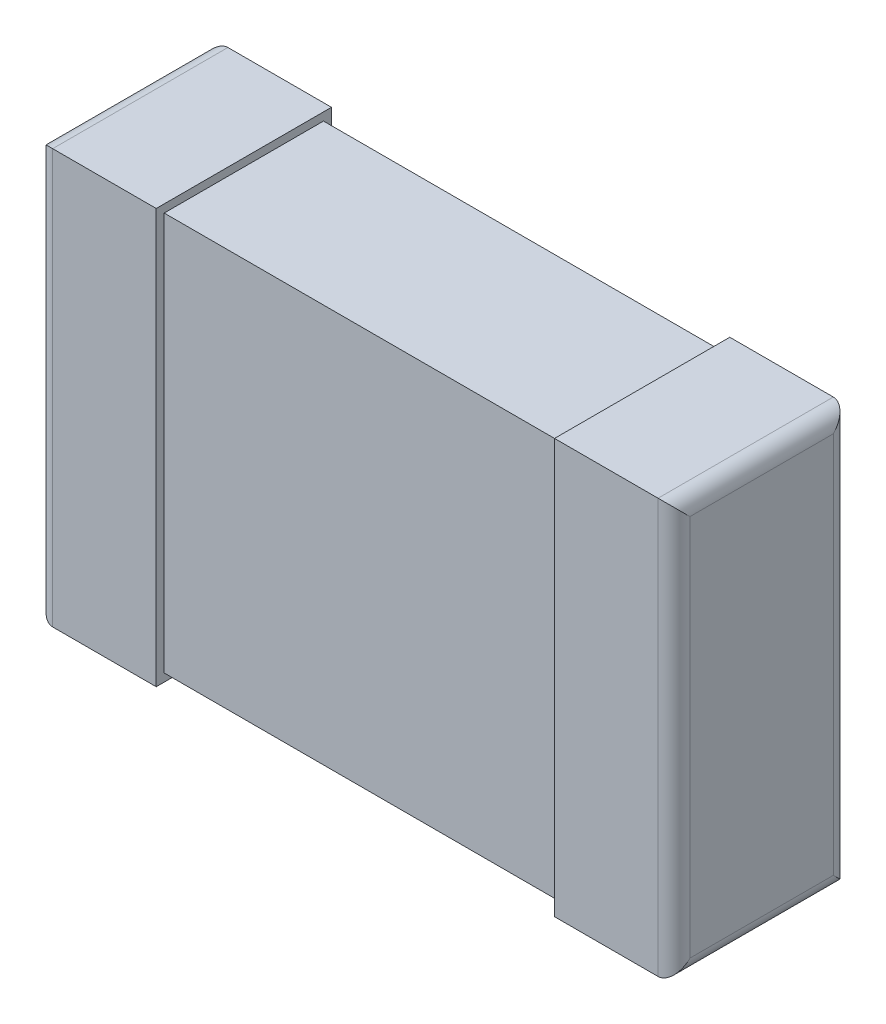
ISO-10303-21;
HEADER;
FILE_DESCRIPTION(('STEP AP214'),'2;1');
FILE_NAME('part.step','',(''),(''),'','','');
FILE_SCHEMA(('AUTOMOTIVE_DESIGN { 1 0 10303 214 1 1 1 1 }'));
ENDSEC;
DATA;
#1=APPLICATION_CONTEXT('core data for automotive mechanical design processes');
#2=APPLICATION_PROTOCOL_DEFINITION('international standard','automotive_design',2000,#1);
#3=PRODUCT_CONTEXT('',#1,'mechanical');
#4=PRODUCT('Part','Part','',(#3));
#5=PRODUCT_RELATED_PRODUCT_CATEGORY('part','',(#4));
#6=PRODUCT_DEFINITION_FORMATION('','',#4);
#7=PRODUCT_DEFINITION_CONTEXT('part definition',#1,'design');
#8=PRODUCT_DEFINITION('design','',#6,#7);
#9=PRODUCT_DEFINITION_SHAPE('','',#8);
#10=(LENGTH_UNIT() NAMED_UNIT(*) SI_UNIT(.MILLI.,.METRE.));
#11=(NAMED_UNIT(*) PLANE_ANGLE_UNIT() SI_UNIT($,.RADIAN.));
#12=(NAMED_UNIT(*) SI_UNIT($,.STERADIAN.) SOLID_ANGLE_UNIT());
#13=UNCERTAINTY_MEASURE_WITH_UNIT(LENGTH_MEASURE(1.E-05),#10,'distance_accuracy_value','');
#14=(GEOMETRIC_REPRESENTATION_CONTEXT(3) GLOBAL_UNCERTAINTY_ASSIGNED_CONTEXT((#13)) GLOBAL_UNIT_ASSIGNED_CONTEXT((#10,
#11,#12)) REPRESENTATION_CONTEXT('',''));
#15=CARTESIAN_POINT('',(0.,0.,0.));
#16=DIRECTION('',(0.,0.,1.));
#17=DIRECTION('',(1.,0.,0.));
#18=AXIS2_PLACEMENT_3D('',#15,#16,#17);
#19=CARTESIAN_POINT('',(0.,0.,0.508));
#20=DIRECTION('',(0.,1.,0.));
#21=DIRECTION('',(0.,0.,1.));
#22=AXIS2_PLACEMENT_3D('',#19,#20,#21);
#23=PLANE('',#22);
#24=DIRECTION('',(0.,0.,-1.));
#25=VECTOR('',#24,1.);
#26=CARTESIAN_POINT('',(1.651,0.,0.508));
#27=LINE('',#26,#25);
#28=CARTESIAN_POINT('',(1.651,0.,0.508));
#29=VERTEX_POINT('',#28);
#30=CARTESIAN_POINT('',(1.651,0.,0.));
#31=VERTEX_POINT('',#30);
#32=EDGE_CURVE('E190',#29,#31,#27,.T.);
#33=ORIENTED_EDGE('',*,*,#32,.F.);
#34=DIRECTION('',(1.,0.,0.));
#35=VECTOR('',#34,1.);
#36=CARTESIAN_POINT('',(0.,0.,0.508));
#37=LINE('',#36,#35);
#38=CARTESIAN_POINT('',(0.381,0.,0.508));
#39=VERTEX_POINT('',#38);
#40=EDGE_CURVE('E224',#39,#29,#37,.T.);
#41=ORIENTED_EDGE('',*,*,#40,.F.);
#42=DIRECTION('',(0.,0.,1.));
#43=VECTOR('',#42,1.);
#44=CARTESIAN_POINT('',(0.381,0.,0.508));
#45=LINE('',#44,#43);
#46=CARTESIAN_POINT('',(0.381,0.,0.));
#47=VERTEX_POINT('',#46);
#48=EDGE_CURVE('E218',#47,#39,#45,.T.);
#49=ORIENTED_EDGE('',*,*,#48,.F.);
#50=DIRECTION('',(1.,0.,0.));
#51=VECTOR('',#50,1.);
#52=CARTESIAN_POINT('',(0.,0.,0.));
#53=LINE('',#52,#51);
#54=EDGE_CURVE('E223',#47,#31,#53,.T.);
#55=ORIENTED_EDGE('',*,*,#54,.T.);
#56=EDGE_LOOP('',(#33,#41,#49,#55));
#57=FACE_BOUND('',#56,.T.);
#58=ADVANCED_FACE('F35',(#57),#23,.F.);
#59=CARTESIAN_POINT('',(0.,1.27,0.508));
#60=DIRECTION('',(0.,-1.,0.));
#61=DIRECTION('',(0.,0.,-1.));
#62=AXIS2_PLACEMENT_3D('',#59,#60,#61);
#63=PLANE('',#62);
#64=DIRECTION('',(0.,0.,1.));
#65=VECTOR('',#64,1.);
#66=CARTESIAN_POINT('',(1.651,1.27,0.508));
#67=LINE('',#66,#65);
#68=CARTESIAN_POINT('',(1.651,1.27,0.));
#69=VERTEX_POINT('',#68);
#70=CARTESIAN_POINT('',(1.651,1.27,0.508));
#71=VERTEX_POINT('',#70);
#72=EDGE_CURVE('E184',#69,#71,#67,.T.);
#73=ORIENTED_EDGE('',*,*,#72,.F.);
#74=DIRECTION('',(-1.,0.,0.));
#75=VECTOR('',#74,1.);
#76=CARTESIAN_POINT('',(0.,1.27,0.));
#77=LINE('',#76,#75);
#78=CARTESIAN_POINT('',(0.381,1.27,0.));
#79=VERTEX_POINT('',#78);
#80=EDGE_CURVE('E228',#69,#79,#77,.T.);
#81=ORIENTED_EDGE('',*,*,#80,.T.);
#82=DIRECTION('',(0.,0.,-1.));
#83=VECTOR('',#82,1.);
#84=CARTESIAN_POINT('',(0.381,1.27,0.508));
#85=LINE('',#84,#83);
#86=CARTESIAN_POINT('',(0.381,1.27,0.508));
#87=VERTEX_POINT('',#86);
#88=EDGE_CURVE('E210',#87,#79,#85,.T.);
#89=ORIENTED_EDGE('',*,*,#88,.F.);
#90=DIRECTION('',(-1.,0.,0.));
#91=VECTOR('',#90,1.);
#92=CARTESIAN_POINT('',(0.,1.27,0.508));
#93=LINE('',#92,#91);
#94=EDGE_CURVE('E227',#71,#87,#93,.T.);
#95=ORIENTED_EDGE('',*,*,#94,.F.);
#96=EDGE_LOOP('',(#73,#81,#89,#95));
#97=FACE_BOUND('',#96,.T.);
#98=ADVANCED_FACE('F320',(#97),#63,.F.);
#99=CARTESIAN_POINT('',(0.,0.,0.508));
#100=DIRECTION('',(0.,0.,-1.));
#101=DIRECTION('',(-1.,0.,0.));
#102=AXIS2_PLACEMENT_3D('',#99,#100,#101);
#103=PLANE('',#102);
#104=DIRECTION('',(0.,-1.,0.));
#105=VECTOR('',#104,1.);
#106=CARTESIAN_POINT('',(1.651,0.,0.508));
#107=LINE('',#106,#105);
#108=EDGE_CURVE('E192',#71,#29,#107,.T.);
#109=ORIENTED_EDGE('',*,*,#108,.F.);
#110=ORIENTED_EDGE('',*,*,#94,.T.);
#111=DIRECTION('',(0.,1.,0.));
#112=VECTOR('',#111,1.);
#113=CARTESIAN_POINT('',(0.381,0.,0.508));
#114=LINE('',#113,#112);
#115=EDGE_CURVE('E220',#39,#87,#114,.T.);
#116=ORIENTED_EDGE('',*,*,#115,.F.);
#117=ORIENTED_EDGE('',*,*,#40,.T.);
#118=EDGE_LOOP('',(#109,#110,#116,#117));
#119=FACE_BOUND('',#118,.T.);
#120=ADVANCED_FACE('F325',(#119),#103,.F.);
#121=CARTESIAN_POINT('',(0.,0.,0.));
#122=DIRECTION('',(0.,0.,-1.));
#123=DIRECTION('',(-1.,0.,0.));
#124=AXIS2_PLACEMENT_3D('',#121,#122,#123);
#125=PLANE('',#124);
#126=ORIENTED_EDGE('',*,*,#80,.F.);
#127=DIRECTION('',(0.,-1.,0.));
#128=VECTOR('',#127,1.);
#129=CARTESIAN_POINT('',(1.651,0.,0.));
#130=LINE('',#129,#128);
#131=EDGE_CURVE('E236',#69,#31,#130,.T.);
#132=ORIENTED_EDGE('',*,*,#131,.T.);
#133=ORIENTED_EDGE('',*,*,#54,.F.);
#134=DIRECTION('',(0.,1.,0.));
#135=VECTOR('',#134,1.);
#136=CARTESIAN_POINT('',(0.381,0.,0.));
#137=LINE('',#136,#135);
#138=EDGE_CURVE('E230',#47,#79,#137,.T.);
#139=ORIENTED_EDGE('',*,*,#138,.T.);
#140=EDGE_LOOP('',(#126,#132,#133,#139));
#141=FACE_BOUND('',#140,.T.);
#142=ADVANCED_FACE('F335',(#141),#125,.T.);
#143=CARTESIAN_POINT('',(0.381,0.,0.));
#144=DIRECTION('',(-1.,0.,0.));
#145=DIRECTION('',(0.,0.,1.));
#146=AXIS2_PLACEMENT_3D('',#143,#144,#145);
#147=PLANE('',#146);
#148=DIRECTION('',(0.,0.,-1.));
#149=VECTOR('',#148,1.);
#150=CARTESIAN_POINT('',(0.381,1.2954,0.5334));
#151=LINE('',#150,#149);
#152=CARTESIAN_POINT('',(0.381,1.2954,0.5334));
#153=VERTEX_POINT('',#152);
#154=CARTESIAN_POINT('',(0.381,1.2954,-0.0254));
#155=VERTEX_POINT('',#154);
#156=EDGE_CURVE('E194',#153,#155,#151,.T.);
#157=ORIENTED_EDGE('',*,*,#156,.F.);
#158=DIRECTION('',(0.,1.,0.));
#159=VECTOR('',#158,1.);
#160=CARTESIAN_POINT('',(0.381,-0.0254,0.5334));
#161=LINE('',#160,#159);
#162=CARTESIAN_POINT('',(0.381,-0.0254,0.5334));
#163=VERTEX_POINT('',#162);
#164=EDGE_CURVE('E203',#163,#153,#161,.T.);
#165=ORIENTED_EDGE('',*,*,#164,.F.);
#166=DIRECTION('',(0.,0.,1.));
#167=VECTOR('',#166,1.);
#168=CARTESIAN_POINT('',(0.381,-0.0254,-0.0254));
#169=LINE('',#168,#167);
#170=CARTESIAN_POINT('',(0.381,-0.0254,-0.0254));
#171=VERTEX_POINT('',#170);
#172=EDGE_CURVE('E200',#171,#163,#169,.T.);
#173=ORIENTED_EDGE('',*,*,#172,.F.);
#174=DIRECTION('',(0.,-1.,0.));
#175=VECTOR('',#174,1.);
#176=CARTESIAN_POINT('',(0.381,1.2954,-0.0254));
#177=LINE('',#176,#175);
#178=EDGE_CURVE('E197',#155,#171,#177,.T.);
#179=ORIENTED_EDGE('',*,*,#178,.F.);
#180=EDGE_LOOP('',(#157,#165,#173,#179));
#181=FACE_BOUND('',#180,.T.);
#182=ORIENTED_EDGE('',*,*,#48,.T.);
#183=ORIENTED_EDGE('',*,*,#115,.T.);
#184=ORIENTED_EDGE('',*,*,#88,.T.);
#185=ORIENTED_EDGE('',*,*,#138,.F.);
#186=EDGE_LOOP('',(#182,#183,#184,#185));
#187=FACE_BOUND('',#186,.T.);
#188=ADVANCED_FACE('F338',(#181,#187),#147,.F.);
#189=CARTESIAN_POINT('',(0.381,1.2954,0.5334));
#190=DIRECTION('',(0.,1.,0.));
#191=DIRECTION('',(0.,0.,1.));
#192=AXIS2_PLACEMENT_3D('',#189,#190,#191);
#193=PLANE('',#192);
#194=DIRECTION('',(-1.,0.,0.));
#195=VECTOR('',#194,1.);
#196=CARTESIAN_POINT('',(0.381,1.2954,-0.0254));
#197=LINE('',#196,#195);
#198=CARTESIAN_POINT('',(0.0508000000000001,1.2954,-0.0254));
#199=VERTEX_POINT('',#198);
#200=EDGE_CURVE('E206',#155,#199,#197,.T.);
#201=ORIENTED_EDGE('',*,*,#200,.T.);
#202=DIRECTION('',(0.,0.,-1.));
#203=VECTOR('',#202,1.);
#204=CARTESIAN_POINT('',(0.0508,1.2954,0.5334));
#205=LINE('',#204,#203);
#206=CARTESIAN_POINT('',(0.0508000000000001,1.2954,0.5334));
#207=VERTEX_POINT('',#206);
#208=EDGE_CURVE('E11',#199,#207,#205,.F.);
#209=ORIENTED_EDGE('',*,*,#208,.T.);
#210=DIRECTION('',(-1.,0.,0.));
#211=VECTOR('',#210,1.);
#212=CARTESIAN_POINT('',(0.381,1.2954,0.5334));
#213=LINE('',#212,#211);
#214=EDGE_CURVE('E207',#153,#207,#213,.T.);
#215=ORIENTED_EDGE('',*,*,#214,.F.);
#216=ORIENTED_EDGE('',*,*,#156,.T.);
#217=EDGE_LOOP('',(#201,#209,#215,#216));
#218=FACE_BOUND('',#217,.T.);
#219=ADVANCED_FACE('F296',(#218),#193,.T.);
#220=CARTESIAN_POINT('',(0.381,-0.0254,0.5334));
#221=DIRECTION('',(0.,0.,1.));
#222=DIRECTION('',(1.,0.,0.));
#223=AXIS2_PLACEMENT_3D('',#220,#221,#222);
#224=PLANE('',#223);
#225=ORIENTED_EDGE('',*,*,#214,.T.);
#226=DIRECTION('',(0.,1.,0.));
#227=VECTOR('',#226,1.);
#228=CARTESIAN_POINT('',(0.0508,-0.0254,0.5334));
#229=LINE('',#228,#227);
#230=CARTESIAN_POINT('',(0.0508000000000001,-0.0254,0.5334));
#231=VERTEX_POINT('',#230);
#232=EDGE_CURVE('E265',#207,#231,#229,.F.);
#233=ORIENTED_EDGE('',*,*,#232,.T.);
#234=DIRECTION('',(-1.,0.,0.));
#235=VECTOR('',#234,1.);
#236=CARTESIAN_POINT('',(0.381,-0.0254,0.5334));
#237=LINE('',#236,#235);
#238=EDGE_CURVE('E211',#163,#231,#237,.T.);
#239=ORIENTED_EDGE('',*,*,#238,.F.);
#240=ORIENTED_EDGE('',*,*,#164,.T.);
#241=EDGE_LOOP('',(#225,#233,#239,#240));
#242=FACE_BOUND('',#241,.T.);
#243=ADVANCED_FACE('F300',(#242),#224,.T.);
#244=CARTESIAN_POINT('',(0.381,-0.0254,-0.0254));
#245=DIRECTION('',(0.,-1.,0.));
#246=DIRECTION('',(0.,0.,-1.));
#247=AXIS2_PLACEMENT_3D('',#244,#245,#246);
#248=PLANE('',#247);
#249=ORIENTED_EDGE('',*,*,#238,.T.);
#250=DIRECTION('',(0.,0.,1.));
#251=VECTOR('',#250,1.);
#252=CARTESIAN_POINT('',(0.0508,-0.0254,-0.0254));
#253=LINE('',#252,#251);
#254=CARTESIAN_POINT('',(0.0508000000000001,-0.0254,-0.0254));
#255=VERTEX_POINT('',#254);
#256=EDGE_CURVE('E59',#231,#255,#253,.F.);
#257=ORIENTED_EDGE('',*,*,#256,.T.);
#258=DIRECTION('',(-1.,0.,0.));
#259=VECTOR('',#258,1.);
#260=CARTESIAN_POINT('',(0.381,-0.0254,-0.0254));
#261=LINE('',#260,#259);
#262=EDGE_CURVE('E213',#171,#255,#261,.T.);
#263=ORIENTED_EDGE('',*,*,#262,.F.);
#264=ORIENTED_EDGE('',*,*,#172,.T.);
#265=EDGE_LOOP('',(#249,#257,#263,#264));
#266=FACE_BOUND('',#265,.T.);
#267=ADVANCED_FACE('F315',(#266),#248,.T.);
#268=CARTESIAN_POINT('',(0.381,1.2954,-0.0254));
#269=DIRECTION('',(0.,0.,-1.));
#270=DIRECTION('',(-1.,0.,0.));
#271=AXIS2_PLACEMENT_3D('',#268,#269,#270);
#272=PLANE('',#271);
#273=ORIENTED_EDGE('',*,*,#262,.T.);
#274=DIRECTION('',(0.,-1.,0.));
#275=VECTOR('',#274,1.);
#276=CARTESIAN_POINT('',(0.0508,1.2954,-0.0254));
#277=LINE('',#276,#275);
#278=EDGE_CURVE('E44',#255,#199,#277,.F.);
#279=ORIENTED_EDGE('',*,*,#278,.T.);
#280=ORIENTED_EDGE('',*,*,#200,.F.);
#281=ORIENTED_EDGE('',*,*,#178,.T.);
#282=EDGE_LOOP('',(#273,#279,#280,#281));
#283=FACE_BOUND('',#282,.T.);
#284=ADVANCED_FACE('F308',(#283),#272,.T.);
#285=CARTESIAN_POINT('',(0.,0.,0.508));
#286=DIRECTION('',(1.,0.,0.));
#287=DIRECTION('',(0.,0.,-1.));
#288=AXIS2_PLACEMENT_3D('',#285,#286,#287);
#289=PLANE('',#288);
#290=DIRECTION('',(0.,0.,1.));
#291=VECTOR('',#290,1.);
#292=CARTESIAN_POINT('',(0.,0.0254,0.5334));
#293=LINE('',#292,#291);
#294=CARTESIAN_POINT('',(0.,0.0254,0.0254));
#295=VERTEX_POINT('',#294);
#296=CARTESIAN_POINT('',(0.,0.0254,0.4826));
#297=VERTEX_POINT('',#296);
#298=EDGE_CURVE('E260',#295,#297,#293,.T.);
#299=ORIENTED_EDGE('',*,*,#298,.T.);
#300=DIRECTION('',(0.,1.,0.));
#301=VECTOR('',#300,1.);
#302=CARTESIAN_POINT('',(0.,1.2954,0.4826));
#303=LINE('',#302,#301);
#304=CARTESIAN_POINT('',(0.,1.2446,0.4826));
#305=VERTEX_POINT('',#304);
#306=EDGE_CURVE('E262',#297,#305,#303,.T.);
#307=ORIENTED_EDGE('',*,*,#306,.T.);
#308=DIRECTION('',(0.,0.,-1.));
#309=VECTOR('',#308,1.);
#310=CARTESIAN_POINT('',(0.,1.2446,-0.0254));
#311=LINE('',#310,#309);
#312=CARTESIAN_POINT('',(0.,1.2446,0.0254));
#313=VERTEX_POINT('',#312);
#314=EDGE_CURVE('E256',#305,#313,#311,.T.);
#315=ORIENTED_EDGE('',*,*,#314,.T.);
#316=DIRECTION('',(0.,-1.,0.));
#317=VECTOR('',#316,1.);
#318=CARTESIAN_POINT('',(0.,-0.0254,0.0254));
#319=LINE('',#318,#317);
#320=EDGE_CURVE('E258',#313,#295,#319,.T.);
#321=ORIENTED_EDGE('',*,*,#320,.T.);
#322=EDGE_LOOP('',(#299,#307,#315,#321));
#323=FACE_BOUND('',#322,.T.);
#324=ADVANCED_FACE('F306',(#323),#289,.F.);
#325=CARTESIAN_POINT('',(1.651,0.,0.));
#326=DIRECTION('',(1.,0.,0.));
#327=DIRECTION('',(0.,0.,1.));
#328=AXIS2_PLACEMENT_3D('',#325,#326,#327);
#329=PLANE('',#328);
#330=DIRECTION('',(0.,0.,-1.));
#331=VECTOR('',#330,1.);
#332=CARTESIAN_POINT('',(1.651,1.2954,0.5334));
#333=LINE('',#332,#331);
#334=CARTESIAN_POINT('',(1.651,1.2954,0.5334));
#335=VERTEX_POINT('',#334);
#336=CARTESIAN_POINT('',(1.651,1.2954,-0.0254));
#337=VERTEX_POINT('',#336);
#338=EDGE_CURVE('E154',#335,#337,#333,.T.);
#339=ORIENTED_EDGE('',*,*,#338,.T.);
#340=DIRECTION('',(0.,-1.,0.));
#341=VECTOR('',#340,1.);
#342=CARTESIAN_POINT('',(1.651,1.2954,-0.0254));
#343=LINE('',#342,#341);
#344=CARTESIAN_POINT('',(1.651,-0.0254,-0.0254));
#345=VERTEX_POINT('',#344);
#346=EDGE_CURVE('E170',#337,#345,#343,.T.);
#347=ORIENTED_EDGE('',*,*,#346,.T.);
#348=DIRECTION('',(0.,0.,1.));
#349=VECTOR('',#348,1.);
#350=CARTESIAN_POINT('',(1.651,-0.0254,-0.0254));
#351=LINE('',#350,#349);
#352=CARTESIAN_POINT('',(1.651,-0.0254,0.5334));
#353=VERTEX_POINT('',#352);
#354=EDGE_CURVE('E157',#345,#353,#351,.T.);
#355=ORIENTED_EDGE('',*,*,#354,.T.);
#356=DIRECTION('',(0.,1.,0.));
#357=VECTOR('',#356,1.);
#358=CARTESIAN_POINT('',(1.651,-0.0254,0.5334));
#359=LINE('',#358,#357);
#360=EDGE_CURVE('E149',#353,#335,#359,.T.);
#361=ORIENTED_EDGE('',*,*,#360,.T.);
#362=EDGE_LOOP('',(#339,#347,#355,#361));
#363=FACE_BOUND('',#362,.T.);
#364=ORIENTED_EDGE('',*,*,#72,.T.);
#365=ORIENTED_EDGE('',*,*,#108,.T.);
#366=ORIENTED_EDGE('',*,*,#32,.T.);
#367=ORIENTED_EDGE('',*,*,#131,.F.);
#368=EDGE_LOOP('',(#364,#365,#366,#367));
#369=FACE_BOUND('',#368,.T.);
#370=ADVANCED_FACE('F151',(#363,#369),#329,.F.);
#371=CARTESIAN_POINT('',(1.651,1.2954,0.5334));
#372=DIRECTION('',(0.,-1.,0.));
#373=DIRECTION('',(0.,0.,-1.));
#374=AXIS2_PLACEMENT_3D('',#371,#372,#373);
#375=PLANE('',#374);
#376=DIRECTION('',(1.,0.,0.));
#377=VECTOR('',#376,1.);
#378=CARTESIAN_POINT('',(1.651,1.2954,0.5334));
#379=LINE('',#378,#377);
#380=CARTESIAN_POINT('',(1.9812,1.2954,0.5334));
#381=VERTEX_POINT('',#380);
#382=EDGE_CURVE('E163',#335,#381,#379,.T.);
#383=ORIENTED_EDGE('',*,*,#382,.T.);
#384=DIRECTION('',(0.,0.,-1.));
#385=VECTOR('',#384,1.);
#386=CARTESIAN_POINT('',(1.9812,1.2954,0.5334));
#387=LINE('',#386,#385);
#388=CARTESIAN_POINT('',(1.9812,1.2954,-0.0254));
#389=VERTEX_POINT('',#388);
#390=EDGE_CURVE('E254',#381,#389,#387,.T.);
#391=ORIENTED_EDGE('',*,*,#390,.T.);
#392=DIRECTION('',(1.,0.,0.));
#393=VECTOR('',#392,1.);
#394=CARTESIAN_POINT('',(1.651,1.2954,-0.0254));
#395=LINE('',#394,#393);
#396=EDGE_CURVE('E174',#337,#389,#395,.T.);
#397=ORIENTED_EDGE('',*,*,#396,.F.);
#398=ORIENTED_EDGE('',*,*,#338,.F.);
#399=EDGE_LOOP('',(#383,#391,#397,#398));
#400=FACE_BOUND('',#399,.T.);
#401=ADVANCED_FACE('F172',(#400),#375,.F.);
#402=CARTESIAN_POINT('',(1.651,1.2954,-0.0254));
#403=DIRECTION('',(0.,0.,1.));
#404=DIRECTION('',(1.,0.,0.));
#405=AXIS2_PLACEMENT_3D('',#402,#403,#404);
#406=PLANE('',#405);
#407=ORIENTED_EDGE('',*,*,#396,.T.);
#408=DIRECTION('',(0.,-1.,0.));
#409=VECTOR('',#408,1.);
#410=CARTESIAN_POINT('',(1.9812,1.2954,-0.0254));
#411=LINE('',#410,#409);
#412=CARTESIAN_POINT('',(1.9812,-0.0254,-0.0254));
#413=VERTEX_POINT('',#412);
#414=EDGE_CURVE('E239',#389,#413,#411,.T.);
#415=ORIENTED_EDGE('',*,*,#414,.T.);
#416=DIRECTION('',(1.,0.,0.));
#417=VECTOR('',#416,1.);
#418=CARTESIAN_POINT('',(1.651,-0.0254,-0.0254));
#419=LINE('',#418,#417);
#420=EDGE_CURVE('E185',#345,#413,#419,.T.);
#421=ORIENTED_EDGE('',*,*,#420,.F.);
#422=ORIENTED_EDGE('',*,*,#346,.F.);
#423=EDGE_LOOP('',(#407,#415,#421,#422));
#424=FACE_BOUND('',#423,.T.);
#425=ADVANCED_FACE('F354',(#424),#406,.F.);
#426=CARTESIAN_POINT('',(1.651,-0.0254,-0.0254));
#427=DIRECTION('',(0.,1.,0.));
#428=DIRECTION('',(0.,0.,1.));
#429=AXIS2_PLACEMENT_3D('',#426,#427,#428);
#430=PLANE('',#429);
#431=ORIENTED_EDGE('',*,*,#420,.T.);
#432=DIRECTION('',(0.,0.,1.));
#433=VECTOR('',#432,1.);
#434=CARTESIAN_POINT('',(1.9812,-0.0254,-0.0254));
#435=LINE('',#434,#433);
#436=CARTESIAN_POINT('',(1.9812,-0.0254,0.5334));
#437=VERTEX_POINT('',#436);
#438=EDGE_CURVE('E251',#413,#437,#435,.T.);
#439=ORIENTED_EDGE('',*,*,#438,.T.);
#440=DIRECTION('',(1.,0.,0.));
#441=VECTOR('',#440,1.);
#442=CARTESIAN_POINT('',(1.651,-0.0254,0.5334));
#443=LINE('',#442,#441);
#444=EDGE_CURVE('E169',#353,#437,#443,.T.);
#445=ORIENTED_EDGE('',*,*,#444,.F.);
#446=ORIENTED_EDGE('',*,*,#354,.F.);
#447=EDGE_LOOP('',(#431,#439,#445,#446));
#448=FACE_BOUND('',#447,.T.);
#449=ADVANCED_FACE('F357',(#448),#430,.F.);
#450=CARTESIAN_POINT('',(1.651,-0.0254,0.5334));
#451=DIRECTION('',(0.,0.,-1.));
#452=DIRECTION('',(-1.,0.,0.));
#453=AXIS2_PLACEMENT_3D('',#450,#451,#452);
#454=PLANE('',#453);
#455=ORIENTED_EDGE('',*,*,#444,.T.);
#456=DIRECTION('',(0.,1.,0.));
#457=VECTOR('',#456,1.);
#458=CARTESIAN_POINT('',(1.9812,-0.0254,0.5334));
#459=LINE('',#458,#457);
#460=EDGE_CURVE('E166',#437,#381,#459,.T.);
#461=ORIENTED_EDGE('',*,*,#460,.T.);
#462=ORIENTED_EDGE('',*,*,#382,.F.);
#463=ORIENTED_EDGE('',*,*,#360,.F.);
#464=EDGE_LOOP('',(#455,#461,#462,#463));
#465=FACE_BOUND('',#464,.T.);
#466=ADVANCED_FACE('F164',(#465),#454,.F.);
#467=CARTESIAN_POINT('',(2.032,0.,0.508));
#468=DIRECTION('',(-1.,0.,0.));
#469=DIRECTION('',(0.,0.,1.));
#470=AXIS2_PLACEMENT_3D('',#467,#468,#469);
#471=PLANE('',#470);
#472=DIRECTION('',(0.,0.,1.));
#473=VECTOR('',#472,1.);
#474=CARTESIAN_POINT('',(2.032,0.0254,0.508));
#475=LINE('',#474,#473);
#476=CARTESIAN_POINT('',(2.032,0.0254,0.4826));
#477=VERTEX_POINT('',#476);
#478=CARTESIAN_POINT('',(2.032,0.0254,0.0254));
#479=VERTEX_POINT('',#478);
#480=EDGE_CURVE('E246',#477,#479,#475,.F.);
#481=ORIENTED_EDGE('',*,*,#480,.T.);
#482=DIRECTION('',(0.,-1.,0.));
#483=VECTOR('',#482,1.);
#484=CARTESIAN_POINT('',(2.032,0.,0.0254));
#485=LINE('',#484,#483);
#486=CARTESIAN_POINT('',(2.032,1.2446,0.0254));
#487=VERTEX_POINT('',#486);
#488=EDGE_CURVE('E248',#479,#487,#485,.F.);
#489=ORIENTED_EDGE('',*,*,#488,.T.);
#490=DIRECTION('',(0.,0.,-1.));
#491=VECTOR('',#490,1.);
#492=CARTESIAN_POINT('',(2.032,1.2446,0.508));
#493=LINE('',#492,#491);
#494=CARTESIAN_POINT('',(2.032,1.2446,0.4826));
#495=VERTEX_POINT('',#494);
#496=EDGE_CURVE('E242',#487,#495,#493,.F.);
#497=ORIENTED_EDGE('',*,*,#496,.T.);
#498=DIRECTION('',(0.,1.,0.));
#499=VECTOR('',#498,1.);
#500=CARTESIAN_POINT('',(2.032,0.,0.4826));
#501=LINE('',#500,#499);
#502=EDGE_CURVE('E244',#495,#477,#501,.F.);
#503=ORIENTED_EDGE('',*,*,#502,.T.);
#504=EDGE_LOOP('',(#481,#489,#497,#503));
#505=FACE_BOUND('',#504,.T.);
#506=ADVANCED_FACE('F330',(#505),#471,.F.);
#507=CARTESIAN_POINT('',(1.9812,-0.0254,0.4826));
#508=DIRECTION('',(0.,1.,0.));
#509=DIRECTION('',(0.,0.,1.));
#510=AXIS2_PLACEMENT_3D('',#507,#508,#509);
#511=CYLINDRICAL_SURFACE('',#510,0.0508);
#512=CARTESIAN_POINT('',(1.9812,0.0254,0.4826));
#513=DIRECTION('',(0.,0.707106781186547,0.707106781186547));
#514=DIRECTION('',(0.,0.707106781186547,-0.707106781186547));
#515=AXIS2_PLACEMENT_3D('',#512,#513,#514);
#516=ELLIPSE('',#515,0.0718420489685532,0.0508);
#517=EDGE_CURVE('E178',#477,#437,#516,.F.);
#518=ORIENTED_EDGE('',*,*,#517,.F.);
#519=ORIENTED_EDGE('',*,*,#502,.F.);
#520=CARTESIAN_POINT('',(1.9812,1.2446,0.4826));
#521=DIRECTION('',(0.,0.707106781186547,-0.707106781186547));
#522=DIRECTION('',(0.,-0.707106781186547,-0.707106781186547));
#523=AXIS2_PLACEMENT_3D('',#520,#521,#522);
#524=ELLIPSE('',#523,0.0718420489685532,0.0508);
#525=EDGE_CURVE('E175',#381,#495,#524,.T.);
#526=ORIENTED_EDGE('',*,*,#525,.F.);
#527=ORIENTED_EDGE('',*,*,#460,.F.);
#528=EDGE_LOOP('',(#518,#519,#526,#527));
#529=FACE_BOUND('',#528,.T.);
#530=ADVANCED_FACE('F332',(#529),#511,.T.);
#531=CARTESIAN_POINT('',(1.9812,1.2446,0.5334));
#532=DIRECTION('',(0.,0.,-1.));
#533=DIRECTION('',(-1.,0.,0.));
#534=AXIS2_PLACEMENT_3D('',#531,#532,#533);
#535=CYLINDRICAL_SURFACE('',#534,0.0508);
#536=ORIENTED_EDGE('',*,*,#525,.T.);
#537=ORIENTED_EDGE('',*,*,#496,.F.);
#538=CARTESIAN_POINT('',(1.9812,1.2446,0.0254));
#539=DIRECTION('',(0.,-0.707106781186547,-0.707106781186547));
#540=DIRECTION('',(0.,0.707106781186547,-0.707106781186547));
#541=AXIS2_PLACEMENT_3D('',#538,#539,#540);
#542=ELLIPSE('',#541,0.0718420489685532,0.0508);
#543=EDGE_CURVE('E272',#389,#487,#542,.T.);
#544=ORIENTED_EDGE('',*,*,#543,.F.);
#545=ORIENTED_EDGE('',*,*,#390,.F.);
#546=EDGE_LOOP('',(#536,#537,#544,#545));
#547=FACE_BOUND('',#546,.T.);
#548=ADVANCED_FACE('F371',(#547),#535,.T.);
#549=CARTESIAN_POINT('',(1.9812,0.0254,-0.0254));
#550=DIRECTION('',(0.,0.,1.));
#551=DIRECTION('',(1.,0.,0.));
#552=AXIS2_PLACEMENT_3D('',#549,#550,#551);
#553=CYLINDRICAL_SURFACE('',#552,0.0508);
#554=ORIENTED_EDGE('',*,*,#517,.T.);
#555=ORIENTED_EDGE('',*,*,#438,.F.);
#556=CARTESIAN_POINT('',(1.9812,0.0254,0.0254));
#557=DIRECTION('',(0.,-0.707106781186547,0.707106781186547));
#558=DIRECTION('',(0.,0.707106781186547,0.707106781186547));
#559=AXIS2_PLACEMENT_3D('',#556,#557,#558);
#560=ELLIPSE('',#559,0.0718420489685532,0.0508);
#561=EDGE_CURVE('E270',#479,#413,#560,.F.);
#562=ORIENTED_EDGE('',*,*,#561,.F.);
#563=ORIENTED_EDGE('',*,*,#480,.F.);
#564=EDGE_LOOP('',(#554,#555,#562,#563));
#565=FACE_BOUND('',#564,.T.);
#566=ADVANCED_FACE('F379',(#565),#553,.T.);
#567=CARTESIAN_POINT('',(1.9812,1.2954,0.0254));
#568=DIRECTION('',(0.,-1.,0.));
#569=DIRECTION('',(0.,0.,-1.));
#570=AXIS2_PLACEMENT_3D('',#567,#568,#569);
#571=CYLINDRICAL_SURFACE('',#570,0.0508);
#572=ORIENTED_EDGE('',*,*,#543,.T.);
#573=ORIENTED_EDGE('',*,*,#488,.F.);
#574=ORIENTED_EDGE('',*,*,#561,.T.);
#575=ORIENTED_EDGE('',*,*,#414,.F.);
#576=EDGE_LOOP('',(#572,#573,#574,#575));
#577=FACE_BOUND('',#576,.T.);
#578=ADVANCED_FACE('F374',(#577),#571,.T.);
#579=CARTESIAN_POINT('',(0.0508,0.,0.0254));
#580=DIRECTION('',(0.,1.,0.));
#581=DIRECTION('',(0.,0.,1.));
#582=AXIS2_PLACEMENT_3D('',#579,#580,#581);
#583=CYLINDRICAL_SURFACE('',#582,0.0508);
#584=CARTESIAN_POINT('',(0.0508,1.2446,0.0254));
#585=DIRECTION('',(0.,0.707106781186547,0.707106781186547));
#586=DIRECTION('',(0.,-0.707106781186547,0.707106781186547));
#587=AXIS2_PLACEMENT_3D('',#584,#585,#586);
#588=ELLIPSE('',#587,0.0718420489685532,0.0508);
#589=EDGE_CURVE('E279',#199,#313,#588,.T.);
#590=ORIENTED_EDGE('',*,*,#589,.F.);
#591=ORIENTED_EDGE('',*,*,#278,.F.);
#592=CARTESIAN_POINT('',(0.0508,0.0254,0.0254));
#593=DIRECTION('',(0.,0.707106781186547,-0.707106781186547));
#594=DIRECTION('',(0.,0.707106781186547,0.707106781186547));
#595=AXIS2_PLACEMENT_3D('',#592,#593,#594);
#596=ELLIPSE('',#595,0.0718420489685532,0.0508);
#597=EDGE_CURVE('E39',#295,#255,#596,.F.);
#598=ORIENTED_EDGE('',*,*,#597,.F.);
#599=ORIENTED_EDGE('',*,*,#320,.F.);
#600=EDGE_LOOP('',(#590,#591,#598,#599));
#601=FACE_BOUND('',#600,.T.);
#602=ADVANCED_FACE('F37',(#601),#583,.T.);
#603=CARTESIAN_POINT('',(0.0508,0.0254,0.508));
#604=DIRECTION('',(0.,0.,-1.));
#605=DIRECTION('',(-1.,0.,0.));
#606=AXIS2_PLACEMENT_3D('',#603,#604,#605);
#607=CYLINDRICAL_SURFACE('',#606,0.0508);
#608=ORIENTED_EDGE('',*,*,#597,.T.);
#609=ORIENTED_EDGE('',*,*,#256,.F.);
#610=CARTESIAN_POINT('',(0.0508,0.0254,0.4826));
#611=DIRECTION('',(0.,-0.707106781186547,-0.707106781186547));
#612=DIRECTION('',(0.,0.707106781186547,-0.707106781186547));
#613=AXIS2_PLACEMENT_3D('',#610,#611,#612);
#614=ELLIPSE('',#613,0.0718420489685532,0.0508);
#615=EDGE_CURVE('E278',#297,#231,#614,.F.);
#616=ORIENTED_EDGE('',*,*,#615,.F.);
#617=ORIENTED_EDGE('',*,*,#298,.F.);
#618=EDGE_LOOP('',(#608,#609,#616,#617));
#619=FACE_BOUND('',#618,.T.);
#620=ADVANCED_FACE('F289',(#619),#607,.T.);
#621=CARTESIAN_POINT('',(0.0508,1.2446,0.508));
#622=DIRECTION('',(0.,0.,1.));
#623=DIRECTION('',(1.,0.,0.));
#624=AXIS2_PLACEMENT_3D('',#621,#622,#623);
#625=CYLINDRICAL_SURFACE('',#624,0.0508);
#626=ORIENTED_EDGE('',*,*,#589,.T.);
#627=ORIENTED_EDGE('',*,*,#314,.F.);
#628=CARTESIAN_POINT('',(0.0508,1.2446,0.4826));
#629=DIRECTION('',(0.,-0.707106781186547,0.707106781186547));
#630=DIRECTION('',(0.,0.707106781186547,0.707106781186547));
#631=AXIS2_PLACEMENT_3D('',#628,#629,#630);
#632=ELLIPSE('',#631,0.0718420489685532,0.0508);
#633=EDGE_CURVE('E276',#207,#305,#632,.T.);
#634=ORIENTED_EDGE('',*,*,#633,.F.);
#635=ORIENTED_EDGE('',*,*,#208,.F.);
#636=EDGE_LOOP('',(#626,#627,#634,#635));
#637=FACE_BOUND('',#636,.T.);
#638=ADVANCED_FACE('F294',(#637),#625,.T.);
#639=CARTESIAN_POINT('',(0.0508,0.,0.4826));
#640=DIRECTION('',(0.,-1.,0.));
#641=DIRECTION('',(0.,0.,-1.));
#642=AXIS2_PLACEMENT_3D('',#639,#640,#641);
#643=CYLINDRICAL_SURFACE('',#642,0.0508);
#644=ORIENTED_EDGE('',*,*,#615,.T.);
#645=ORIENTED_EDGE('',*,*,#232,.F.);
#646=ORIENTED_EDGE('',*,*,#633,.T.);
#647=ORIENTED_EDGE('',*,*,#306,.F.);
#648=EDGE_LOOP('',(#644,#645,#646,#647));
#649=FACE_BOUND('',#648,.T.);
#650=ADVANCED_FACE('F303',(#649),#643,.T.);
#651=CLOSED_SHELL('',(#58,#98,#120,#142,#188,#219,#243,#267,#284,#324,#370,#401,#425,#449,#466,
#506,#530,#548,#566,#578,#602,#620,#638,#650));
#652=MANIFOLD_SOLID_BREP('B2',#651);
#653=ADVANCED_BREP_SHAPE_REPRESENTATION('',(#18,#652),#14);
#654=SHAPE_DEFINITION_REPRESENTATION(#9,#653);
ENDSEC;
END-ISO-10303-21;
